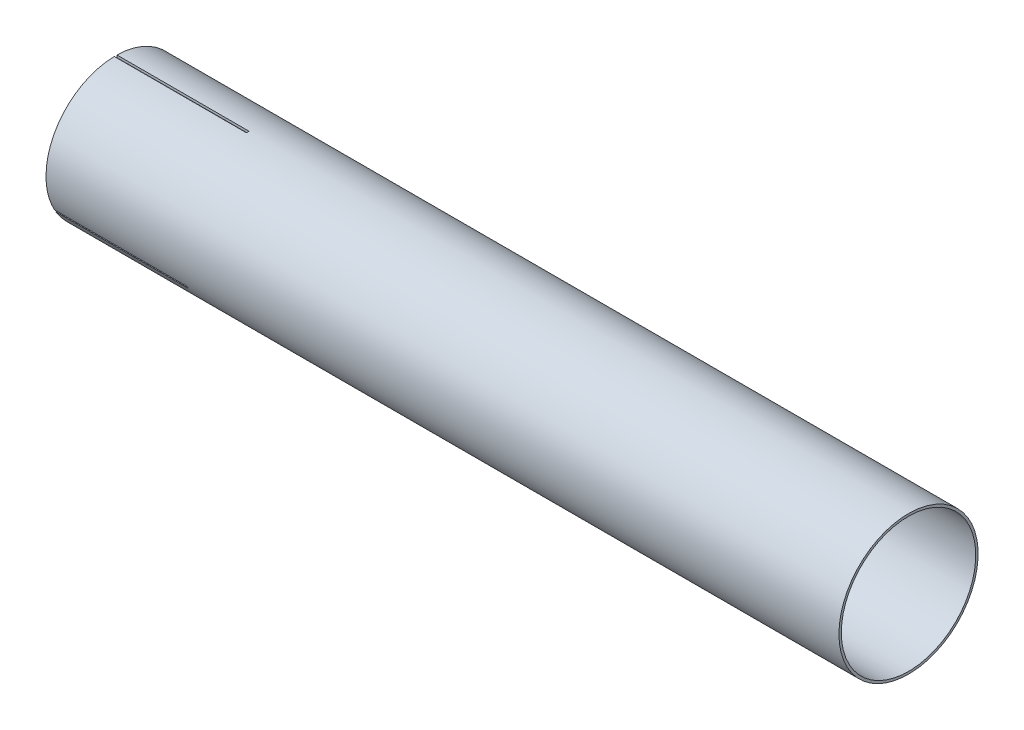
ISO-10303-21;
HEADER;
FILE_DESCRIPTION(('STEP AP214'),'2;1');
FILE_NAME('part.step','',(''),(''),'','','');
FILE_SCHEMA(('AUTOMOTIVE_DESIGN { 1 0 10303 214 1 1 1 1 }'));
ENDSEC;
DATA;
#1=APPLICATION_CONTEXT('core data for automotive mechanical design processes');
#2=APPLICATION_PROTOCOL_DEFINITION('international standard','automotive_design',2000,#1);
#3=PRODUCT_CONTEXT('',#1,'mechanical');
#4=PRODUCT('Part','Part','',(#3));
#5=PRODUCT_RELATED_PRODUCT_CATEGORY('part','',(#4));
#6=PRODUCT_DEFINITION_FORMATION('','',#4);
#7=PRODUCT_DEFINITION_CONTEXT('part definition',#1,'design');
#8=PRODUCT_DEFINITION('design','',#6,#7);
#9=PRODUCT_DEFINITION_SHAPE('','',#8);
#10=(LENGTH_UNIT() NAMED_UNIT(*) SI_UNIT(.MILLI.,.METRE.));
#11=(NAMED_UNIT(*) PLANE_ANGLE_UNIT() SI_UNIT($,.RADIAN.));
#12=(NAMED_UNIT(*) SI_UNIT($,.STERADIAN.) SOLID_ANGLE_UNIT());
#13=UNCERTAINTY_MEASURE_WITH_UNIT(LENGTH_MEASURE(1.E-05),#10,'distance_accuracy_value','');
#14=(GEOMETRIC_REPRESENTATION_CONTEXT(3) GLOBAL_UNCERTAINTY_ASSIGNED_CONTEXT((#13)) GLOBAL_UNIT_ASSIGNED_CONTEXT((#10,
#11,#12)) REPRESENTATION_CONTEXT('',''));
#15=CARTESIAN_POINT('',(0.,0.,0.));
#16=DIRECTION('',(0.,0.,1.));
#17=DIRECTION('',(1.,0.,0.));
#18=AXIS2_PLACEMENT_3D('',#15,#16,#17);
#19=CARTESIAN_POINT('',(0.,79.,0.));
#20=DIRECTION('',(1.,0.,0.));
#21=DIRECTION('',(0.,0.,-1.));
#22=AXIS2_PLACEMENT_3D('',#19,#20,#21);
#23=PLANE('',#22);
#24=DIRECTION('',(0.,0.500000000000004,0.866025403784436));
#25=VECTOR('',#24,1.);
#26=CARTESIAN_POINT('',(0.,-55.2570415551625,-92.7080034494852));
#27=LINE('',#26,#25);
#28=CARTESIAN_POINT('',(0.,-40.7919172106498,-67.653673146988));
#29=VERTEX_POINT('',#28);
#30=CARTESIAN_POINT('',(0.,-39.4366642116632,-65.3063060956331));
#31=VERTEX_POINT('',#30);
#32=EDGE_CURVE('E192',#29,#31,#27,.T.);
#33=ORIENTED_EDGE('',*,*,#32,.F.);
#34=CARTESIAN_POINT('',(0.,0.,0.));
#35=DIRECTION('',(-1.,0.,0.));
#36=DIRECTION('',(0.,0.,1.));
#37=AXIS2_PLACEMENT_3D('',#34,#35,#36);
#38=CIRCLE('',#37,79.);
#39=CARTESIAN_POINT('',(0.,-40.7919172106488,67.6536731469886));
#40=VERTEX_POINT('',#39);
#41=EDGE_CURVE('E144',#29,#40,#38,.T.);
#42=ORIENTED_EDGE('',*,*,#41,.T.);
#43=DIRECTION('',(0.,0.499999999999991,-0.866025403784444));
#44=VECTOR('',#43,1.);
#45=CARTESIAN_POINT('',(0.,-55.2570415551609,92.7080034494856));
#46=LINE('',#45,#44);
#47=CARTESIAN_POINT('',(0.,-39.4366642116622,65.3063060956337));
#48=VERTEX_POINT('',#47);
#49=EDGE_CURVE('E199',#40,#48,#46,.T.);
#50=ORIENTED_EDGE('',*,*,#49,.T.);
#51=CARTESIAN_POINT('',(0.,0.,0.));
#52=DIRECTION('',(-1.,0.,0.));
#53=DIRECTION('',(0.,0.,1.));
#54=AXIS2_PLACEMENT_3D('',#51,#52,#53);
#55=CIRCLE('',#54,76.29);
#56=EDGE_CURVE('E170',#31,#48,#55,.T.);
#57=ORIENTED_EDGE('',*,*,#56,.F.);
#58=EDGE_LOOP('',(#33,#42,#50,#57));
#59=FACE_BOUND('',#58,.T.);
#60=ADVANCED_FACE('F36',(#59),#23,.F.);
#61=DIRECTION('',(0.,0.500000000000004,0.866025403784436));
#62=VECTOR('',#61,1.);
#63=CARTESIAN_POINT('',(0.,-52.6589653438092,-94.2080034494852));
#64=LINE('',#63,#62);
#65=CARTESIAN_POINT('',(0.,-38.1938409992965,-69.153673146988));
#66=VERTEX_POINT('',#65);
#67=CARTESIAN_POINT('',(0.,-36.8385880003099,-66.8063060956331));
#68=VERTEX_POINT('',#67);
#69=EDGE_CURVE('E207',#66,#68,#64,.T.);
#70=ORIENTED_EDGE('',*,*,#69,.T.);
#71=CARTESIAN_POINT('',(0.,76.2752522119724,-1.5));
#72=VERTEX_POINT('',#71);
#73=EDGE_CURVE('E166',#72,#68,#55,.T.);
#74=ORIENTED_EDGE('',*,*,#73,.F.);
#75=DIRECTION('',(0.,-1.,0.));
#76=VECTOR('',#75,1.);
#77=CARTESIAN_POINT('',(0.,79.,-1.5));
#78=LINE('',#77,#76);
#79=CARTESIAN_POINT('',(0.,78.9857582099457,-1.5));
#80=VERTEX_POINT('',#79);
#81=EDGE_CURVE('E219',#80,#72,#78,.T.);
#82=ORIENTED_EDGE('',*,*,#81,.F.);
#83=EDGE_CURVE('E147',#80,#66,#38,.T.);
#84=ORIENTED_EDGE('',*,*,#83,.T.);
#85=EDGE_LOOP('',(#70,#74,#82,#84));
#86=FACE_BOUND('',#85,.T.);
#87=ADVANCED_FACE('F246',(#86),#23,.F.);
#88=DIRECTION('',(0.,0.499999999999991,-0.866025403784444));
#89=VECTOR('',#88,1.);
#90=CARTESIAN_POINT('',(0.,-52.6589653438076,94.2080034494856));
#91=LINE('',#90,#89);
#92=CARTESIAN_POINT('',(0.,-38.1938409992955,69.1536731469886));
#93=VERTEX_POINT('',#92);
#94=CARTESIAN_POINT('',(0.,-36.8385880003089,66.8063060956337));
#95=VERTEX_POINT('',#94);
#96=EDGE_CURVE('E124',#93,#95,#91,.T.);
#97=ORIENTED_EDGE('',*,*,#96,.F.);
#98=CARTESIAN_POINT('',(0.,78.9857582099457,1.5));
#99=VERTEX_POINT('',#98);
#100=EDGE_CURVE('E136',#93,#99,#38,.T.);
#101=ORIENTED_EDGE('',*,*,#100,.T.);
#102=DIRECTION('',(0.,-1.,0.));
#103=VECTOR('',#102,1.);
#104=CARTESIAN_POINT('',(0.,79.,1.5));
#105=LINE('',#104,#103);
#106=CARTESIAN_POINT('',(0.,76.2752522119724,1.5));
#107=VERTEX_POINT('',#106);
#108=EDGE_CURVE('E227',#99,#107,#105,.T.);
#109=ORIENTED_EDGE('',*,*,#108,.T.);
#110=EDGE_CURVE('E138',#95,#107,#55,.T.);
#111=ORIENTED_EDGE('',*,*,#110,.F.);
#112=EDGE_LOOP('',(#97,#101,#109,#111));
#113=FACE_BOUND('',#112,.T.);
#114=ADVANCED_FACE('F134',(#113),#23,.F.);
#115=CARTESIAN_POINT('',(0.,0.,0.));
#116=DIRECTION('',(-1.,0.,0.));
#117=DIRECTION('',(0.,0.,1.));
#118=AXIS2_PLACEMENT_3D('',#115,#116,#117);
#119=CYLINDRICAL_SURFACE('',#118,76.29);
#120=CARTESIAN_POINT('',(900.,0.,0.));
#121=DIRECTION('',(-1.,0.,0.));
#122=DIRECTION('',(0.,0.,1.));
#123=AXIS2_PLACEMENT_3D('',#120,#121,#122);
#124=CIRCLE('',#123,76.29);
#125=CARTESIAN_POINT('',(900.,0.,76.29));
#126=VERTEX_POINT('',#125);
#127=EDGE_CURVE('E160',#126,#126,#124,.T.);
#128=ORIENTED_EDGE('',*,*,#127,.F.);
#129=EDGE_LOOP('',(#128));
#130=FACE_BOUND('',#129,.T.);
#131=DIRECTION('',(-1.,0.,0.));
#132=VECTOR('',#131,1.);
#133=CARTESIAN_POINT('',(0.,-39.4366642116632,-65.3063060956331));
#134=LINE('',#133,#132);
#135=CARTESIAN_POINT('',(150.,-39.4366642116632,-65.3063060956331));
#136=VERTEX_POINT('',#135);
#137=EDGE_CURVE('E191',#31,#136,#134,.F.);
#138=ORIENTED_EDGE('',*,*,#137,.F.);
#139=ORIENTED_EDGE('',*,*,#56,.T.);
#140=DIRECTION('',(-1.,0.,0.));
#141=VECTOR('',#140,1.);
#142=CARTESIAN_POINT('',(0.,-39.4366642116622,65.3063060956337));
#143=LINE('',#142,#141);
#144=CARTESIAN_POINT('',(150.,-39.4366642116622,65.3063060956337));
#145=VERTEX_POINT('',#144);
#146=EDGE_CURVE('E211',#145,#48,#143,.T.);
#147=ORIENTED_EDGE('',*,*,#146,.F.);
#148=CARTESIAN_POINT('',(150.,0.,0.));
#149=DIRECTION('',(-1.,0.,0.));
#150=DIRECTION('',(0.,0.,1.));
#151=AXIS2_PLACEMENT_3D('',#148,#149,#150);
#152=CIRCLE('',#151,76.29);
#153=CARTESIAN_POINT('',(150.,-36.8385880003089,66.8063060956337));
#154=VERTEX_POINT('',#153);
#155=EDGE_CURVE('E215',#154,#145,#152,.F.);
#156=ORIENTED_EDGE('',*,*,#155,.F.);
#157=DIRECTION('',(-1.,0.,0.));
#158=VECTOR('',#157,1.);
#159=CARTESIAN_POINT('',(0.,-36.8385880003089,66.8063060956337));
#160=LINE('',#159,#158);
#161=EDGE_CURVE('E209',#95,#154,#160,.F.);
#162=ORIENTED_EDGE('',*,*,#161,.F.);
#163=ORIENTED_EDGE('',*,*,#110,.T.);
#164=DIRECTION('',(-1.,0.,0.));
#165=VECTOR('',#164,1.);
#166=CARTESIAN_POINT('',(0.,76.2752522119724,1.5));
#167=LINE('',#166,#165);
#168=CARTESIAN_POINT('',(150.,76.2752522119724,1.5));
#169=VERTEX_POINT('',#168);
#170=EDGE_CURVE('E145',#169,#107,#167,.T.);
#171=ORIENTED_EDGE('',*,*,#170,.F.);
#172=CARTESIAN_POINT('',(150.,0.,0.));
#173=DIRECTION('',(-1.,0.,0.));
#174=DIRECTION('',(0.,0.,1.));
#175=AXIS2_PLACEMENT_3D('',#172,#173,#174);
#176=CIRCLE('',#175,76.29);
#177=CARTESIAN_POINT('',(150.,76.2752522119724,-1.5));
#178=VERTEX_POINT('',#177);
#179=EDGE_CURVE('E150',#178,#169,#176,.F.);
#180=ORIENTED_EDGE('',*,*,#179,.F.);
#181=DIRECTION('',(-1.,0.,0.));
#182=VECTOR('',#181,1.);
#183=CARTESIAN_POINT('',(0.,76.2752522119724,-1.5));
#184=LINE('',#183,#182);
#185=EDGE_CURVE('E229',#72,#178,#184,.F.);
#186=ORIENTED_EDGE('',*,*,#185,.F.);
#187=ORIENTED_EDGE('',*,*,#73,.T.);
#188=DIRECTION('',(-1.,0.,0.));
#189=VECTOR('',#188,1.);
#190=CARTESIAN_POINT('',(0.,-36.8385880003099,-66.8063060956331));
#191=LINE('',#190,#189);
#192=CARTESIAN_POINT('',(150.,-36.8385880003099,-66.8063060956331));
#193=VERTEX_POINT('',#192);
#194=EDGE_CURVE('E216',#193,#68,#191,.T.);
#195=ORIENTED_EDGE('',*,*,#194,.F.);
#196=EDGE_CURVE('E213',#136,#193,#152,.F.);
#197=ORIENTED_EDGE('',*,*,#196,.F.);
#198=EDGE_LOOP('',(#138,#139,#147,#156,#162,#163,#171,#180,#186,#187,#195,#197));
#199=FACE_BOUND('',#198,.T.);
#200=ADVANCED_FACE('F240',(#130,#199),#119,.F.);
#201=CARTESIAN_POINT('',(0.,0.,0.));
#202=DIRECTION('',(-1.,0.,0.));
#203=DIRECTION('',(0.,0.,1.));
#204=AXIS2_PLACEMENT_3D('',#201,#202,#203);
#205=CYLINDRICAL_SURFACE('',#204,79.);
#206=CARTESIAN_POINT('',(900.,0.,0.));
#207=DIRECTION('',(-1.,0.,0.));
#208=DIRECTION('',(0.,0.,1.));
#209=AXIS2_PLACEMENT_3D('',#206,#207,#208);
#210=CIRCLE('',#209,79.);
#211=CARTESIAN_POINT('',(900.,0.,79.));
#212=VERTEX_POINT('',#211);
#213=EDGE_CURVE('E154',#212,#212,#210,.T.);
#214=ORIENTED_EDGE('',*,*,#213,.T.);
#215=EDGE_LOOP('',(#214));
#216=FACE_BOUND('',#215,.T.);
#217=DIRECTION('',(-1.,0.,0.));
#218=VECTOR('',#217,1.);
#219=CARTESIAN_POINT('',(0.,-40.7919172106498,-67.653673146988));
#220=LINE('',#219,#218);
#221=CARTESIAN_POINT('',(150.,-40.7919172106498,-67.653673146988));
#222=VERTEX_POINT('',#221);
#223=EDGE_CURVE('E11',#222,#29,#220,.T.);
#224=ORIENTED_EDGE('',*,*,#223,.F.);
#225=CARTESIAN_POINT('',(150.,0.,0.));
#226=DIRECTION('',(-1.,0.,0.));
#227=DIRECTION('',(0.,0.,1.));
#228=AXIS2_PLACEMENT_3D('',#225,#226,#227);
#229=CIRCLE('',#228,79.);
#230=CARTESIAN_POINT('',(150.,-38.1938409992965,-69.153673146988));
#231=VERTEX_POINT('',#230);
#232=EDGE_CURVE('E178',#231,#222,#229,.T.);
#233=ORIENTED_EDGE('',*,*,#232,.F.);
#234=DIRECTION('',(-1.,0.,0.));
#235=VECTOR('',#234,1.);
#236=CARTESIAN_POINT('',(0.,-38.1938409992965,-69.153673146988));
#237=LINE('',#236,#235);
#238=EDGE_CURVE('E43',#66,#231,#237,.F.);
#239=ORIENTED_EDGE('',*,*,#238,.F.);
#240=ORIENTED_EDGE('',*,*,#83,.F.);
#241=DIRECTION('',(-1.,0.,0.));
#242=VECTOR('',#241,1.);
#243=CARTESIAN_POINT('',(0.,78.9857582099457,-1.5));
#244=LINE('',#243,#242);
#245=CARTESIAN_POINT('',(150.,78.9857582099457,-1.5));
#246=VERTEX_POINT('',#245);
#247=EDGE_CURVE('E173',#246,#80,#244,.T.);
#248=ORIENTED_EDGE('',*,*,#247,.F.);
#249=CARTESIAN_POINT('',(150.,0.,0.));
#250=DIRECTION('',(-1.,0.,0.));
#251=DIRECTION('',(0.,0.,1.));
#252=AXIS2_PLACEMENT_3D('',#249,#250,#251);
#253=CIRCLE('',#252,79.);
#254=CARTESIAN_POINT('',(150.,78.9857582099457,1.5));
#255=VERTEX_POINT('',#254);
#256=EDGE_CURVE('E169',#255,#246,#253,.T.);
#257=ORIENTED_EDGE('',*,*,#256,.F.);
#258=DIRECTION('',(-1.,0.,0.));
#259=VECTOR('',#258,1.);
#260=CARTESIAN_POINT('',(0.,78.9857582099457,1.5));
#261=LINE('',#260,#259);
#262=EDGE_CURVE('E130',#99,#255,#261,.F.);
#263=ORIENTED_EDGE('',*,*,#262,.F.);
#264=ORIENTED_EDGE('',*,*,#100,.F.);
#265=DIRECTION('',(-1.,0.,0.));
#266=VECTOR('',#265,1.);
#267=CARTESIAN_POINT('',(0.,-38.1938409992955,69.1536731469886));
#268=LINE('',#267,#266);
#269=CARTESIAN_POINT('',(150.,-38.1938409992955,69.1536731469886));
#270=VERTEX_POINT('',#269);
#271=EDGE_CURVE('E121',#270,#93,#268,.T.);
#272=ORIENTED_EDGE('',*,*,#271,.F.);
#273=CARTESIAN_POINT('',(150.,-40.7919172106488,67.6536731469886));
#274=VERTEX_POINT('',#273);
#275=EDGE_CURVE('E129',#274,#270,#229,.T.);
#276=ORIENTED_EDGE('',*,*,#275,.F.);
#277=DIRECTION('',(-1.,0.,0.));
#278=VECTOR('',#277,1.);
#279=CARTESIAN_POINT('',(0.,-40.7919172106488,67.6536731469886));
#280=LINE('',#279,#278);
#281=EDGE_CURVE('E177',#40,#274,#280,.F.);
#282=ORIENTED_EDGE('',*,*,#281,.F.);
#283=ORIENTED_EDGE('',*,*,#41,.F.);
#284=EDGE_LOOP('',(#224,#233,#239,#240,#248,#257,#263,#264,#272,#276,#282,#283));
#285=FACE_BOUND('',#284,.T.);
#286=ADVANCED_FACE('F142',(#216,#285),#205,.T.);
#287=CARTESIAN_POINT('',(900.,79.,0.));
#288=DIRECTION('',(-1.,0.,0.));
#289=DIRECTION('',(0.,0.,1.));
#290=AXIS2_PLACEMENT_3D('',#287,#288,#289);
#291=PLANE('',#290);
#292=ORIENTED_EDGE('',*,*,#213,.F.);
#293=EDGE_LOOP('',(#292));
#294=FACE_BOUND('',#293,.T.);
#295=ORIENTED_EDGE('',*,*,#127,.T.);
#296=EDGE_LOOP('',(#295));
#297=FACE_BOUND('',#296,.T.);
#298=ADVANCED_FACE('F273',(#294,#297),#291,.F.);
#299=CARTESIAN_POINT('',(0.,79.,1.5));
#300=DIRECTION('',(0.,0.,-1.));
#301=DIRECTION('',(-1.,0.,0.));
#302=AXIS2_PLACEMENT_3D('',#299,#300,#301);
#303=PLANE('',#302);
#304=ORIENTED_EDGE('',*,*,#170,.T.);
#305=ORIENTED_EDGE('',*,*,#108,.F.);
#306=ORIENTED_EDGE('',*,*,#262,.T.);
#307=DIRECTION('',(0.,-1.,0.));
#308=VECTOR('',#307,1.);
#309=CARTESIAN_POINT('',(150.,79.,1.5));
#310=LINE('',#309,#308);
#311=EDGE_CURVE('E224',#255,#169,#310,.T.);
#312=ORIENTED_EDGE('',*,*,#311,.T.);
#313=EDGE_LOOP('',(#304,#305,#306,#312));
#314=FACE_BOUND('',#313,.T.);
#315=ADVANCED_FACE('F239',(#314),#303,.T.);
#316=CARTESIAN_POINT('',(150.,79.,1.5));
#317=DIRECTION('',(-1.,0.,0.));
#318=DIRECTION('',(0.,0.,1.));
#319=AXIS2_PLACEMENT_3D('',#316,#317,#318);
#320=PLANE('',#319);
#321=ORIENTED_EDGE('',*,*,#179,.T.);
#322=ORIENTED_EDGE('',*,*,#311,.F.);
#323=ORIENTED_EDGE('',*,*,#256,.T.);
#324=DIRECTION('',(0.,-1.,0.));
#325=VECTOR('',#324,1.);
#326=CARTESIAN_POINT('',(150.,79.,-1.5));
#327=LINE('',#326,#325);
#328=EDGE_CURVE('E221',#246,#178,#327,.T.);
#329=ORIENTED_EDGE('',*,*,#328,.T.);
#330=EDGE_LOOP('',(#321,#322,#323,#329));
#331=FACE_BOUND('',#330,.T.);
#332=ADVANCED_FACE('F234',(#331),#320,.T.);
#333=CARTESIAN_POINT('',(0.,79.,-1.5));
#334=DIRECTION('',(0.,0.,1.));
#335=DIRECTION('',(1.,0.,0.));
#336=AXIS2_PLACEMENT_3D('',#333,#334,#335);
#337=PLANE('',#336);
#338=ORIENTED_EDGE('',*,*,#185,.T.);
#339=ORIENTED_EDGE('',*,*,#328,.F.);
#340=ORIENTED_EDGE('',*,*,#247,.T.);
#341=ORIENTED_EDGE('',*,*,#81,.T.);
#342=EDGE_LOOP('',(#338,#339,#340,#341));
#343=FACE_BOUND('',#342,.T.);
#344=ADVANCED_FACE('F248',(#343),#337,.T.);
#345=CARTESIAN_POINT('',(0.,-55.2570415551609,92.7080034494856));
#346=DIRECTION('',(0.,0.866025403784444,0.499999999999991));
#347=DIRECTION('',(0.,-0.499999999999991,0.866025403784444));
#348=AXIS2_PLACEMENT_3D('',#345,#346,#347);
#349=PLANE('',#348);
#350=ORIENTED_EDGE('',*,*,#146,.T.);
#351=ORIENTED_EDGE('',*,*,#49,.F.);
#352=ORIENTED_EDGE('',*,*,#281,.T.);
#353=DIRECTION('',(0.,0.499999999999991,-0.866025403784444));
#354=VECTOR('',#353,1.);
#355=CARTESIAN_POINT('',(150.,-55.2570415551609,92.7080034494856));
#356=LINE('',#355,#354);
#357=EDGE_CURVE('E202',#274,#145,#356,.T.);
#358=ORIENTED_EDGE('',*,*,#357,.T.);
#359=EDGE_LOOP('',(#350,#351,#352,#358));
#360=FACE_BOUND('',#359,.T.);
#361=ADVANCED_FACE('F251',(#360),#349,.T.);
#362=CARTESIAN_POINT('',(0.,-52.6589653438076,94.2080034494856));
#363=DIRECTION('',(0.,-0.866025403784444,-0.499999999999991));
#364=DIRECTION('',(0.,0.499999999999991,-0.866025403784444));
#365=AXIS2_PLACEMENT_3D('',#362,#363,#364);
#366=PLANE('',#365);
#367=ORIENTED_EDGE('',*,*,#161,.T.);
#368=DIRECTION('',(0.,0.499999999999991,-0.866025403784444));
#369=VECTOR('',#368,1.);
#370=CARTESIAN_POINT('',(150.,-52.6589653438076,94.2080034494856));
#371=LINE('',#370,#369);
#372=EDGE_CURVE('E58',#270,#154,#371,.T.);
#373=ORIENTED_EDGE('',*,*,#372,.F.);
#374=ORIENTED_EDGE('',*,*,#271,.T.);
#375=ORIENTED_EDGE('',*,*,#96,.T.);
#376=EDGE_LOOP('',(#367,#373,#374,#375));
#377=FACE_BOUND('',#376,.T.);
#378=ADVANCED_FACE('F123',(#377),#366,.T.);
#379=CARTESIAN_POINT('',(150.,-52.6589653438092,-94.2080034494852));
#380=DIRECTION('',(-1.,0.,0.));
#381=DIRECTION('',(0.,0.,1.));
#382=AXIS2_PLACEMENT_3D('',#379,#380,#381);
#383=PLANE('',#382);
#384=ORIENTED_EDGE('',*,*,#155,.T.);
#385=ORIENTED_EDGE('',*,*,#357,.F.);
#386=ORIENTED_EDGE('',*,*,#275,.T.);
#387=ORIENTED_EDGE('',*,*,#372,.T.);
#388=EDGE_LOOP('',(#384,#385,#386,#387));
#389=FACE_BOUND('',#388,.T.);
#390=ADVANCED_FACE('F332',(#389),#383,.T.);
#391=CARTESIAN_POINT('',(0.,-55.2570415551625,-92.7080034494852));
#392=DIRECTION('',(0.,0.866025403784436,-0.500000000000004));
#393=DIRECTION('',(0.,0.500000000000004,0.866025403784436));
#394=AXIS2_PLACEMENT_3D('',#391,#392,#393);
#395=PLANE('',#394);
#396=ORIENTED_EDGE('',*,*,#137,.T.);
#397=DIRECTION('',(0.,0.500000000000004,0.866025403784436));
#398=VECTOR('',#397,1.);
#399=CARTESIAN_POINT('',(150.,-55.2570415551625,-92.7080034494852));
#400=LINE('',#399,#398);
#401=EDGE_CURVE('E185',#222,#136,#400,.T.);
#402=ORIENTED_EDGE('',*,*,#401,.F.);
#403=ORIENTED_EDGE('',*,*,#223,.T.);
#404=ORIENTED_EDGE('',*,*,#32,.T.);
#405=EDGE_LOOP('',(#396,#402,#403,#404));
#406=FACE_BOUND('',#405,.T.);
#407=ADVANCED_FACE('F188',(#406),#395,.T.);
#408=CARTESIAN_POINT('',(0.,-52.6589653438092,-94.2080034494852));
#409=DIRECTION('',(0.,-0.866025403784436,0.500000000000004));
#410=DIRECTION('',(0.,-0.500000000000004,-0.866025403784436));
#411=AXIS2_PLACEMENT_3D('',#408,#409,#410);
#412=PLANE('',#411);
#413=ORIENTED_EDGE('',*,*,#194,.T.);
#414=ORIENTED_EDGE('',*,*,#69,.F.);
#415=ORIENTED_EDGE('',*,*,#238,.T.);
#416=DIRECTION('',(0.,0.500000000000004,0.866025403784436));
#417=VECTOR('',#416,1.);
#418=CARTESIAN_POINT('',(150.,-52.6589653438092,-94.2080034494852));
#419=LINE('',#418,#417);
#420=EDGE_CURVE('E50',#231,#193,#419,.T.);
#421=ORIENTED_EDGE('',*,*,#420,.T.);
#422=EDGE_LOOP('',(#413,#414,#415,#421));
#423=FACE_BOUND('',#422,.T.);
#424=ADVANCED_FACE('F244',(#423),#412,.T.);
#425=ORIENTED_EDGE('',*,*,#196,.T.);
#426=ORIENTED_EDGE('',*,*,#420,.F.);
#427=ORIENTED_EDGE('',*,*,#232,.T.);
#428=ORIENTED_EDGE('',*,*,#401,.T.);
#429=EDGE_LOOP('',(#425,#426,#427,#428));
#430=FACE_BOUND('',#429,.T.);
#431=ADVANCED_FACE('F184',(#430),#383,.T.);
#432=CLOSED_SHELL('',(#60,#87,#114,#200,#286,#298,#315,#332,#344,#361,#378,#390,#407,#424,#431));
#433=MANIFOLD_SOLID_BREP('B2',#432);
#434=ADVANCED_BREP_SHAPE_REPRESENTATION('',(#18,#433),#14);
#435=SHAPE_DEFINITION_REPRESENTATION(#9,#434);
ENDSEC;
END-ISO-10303-21;
